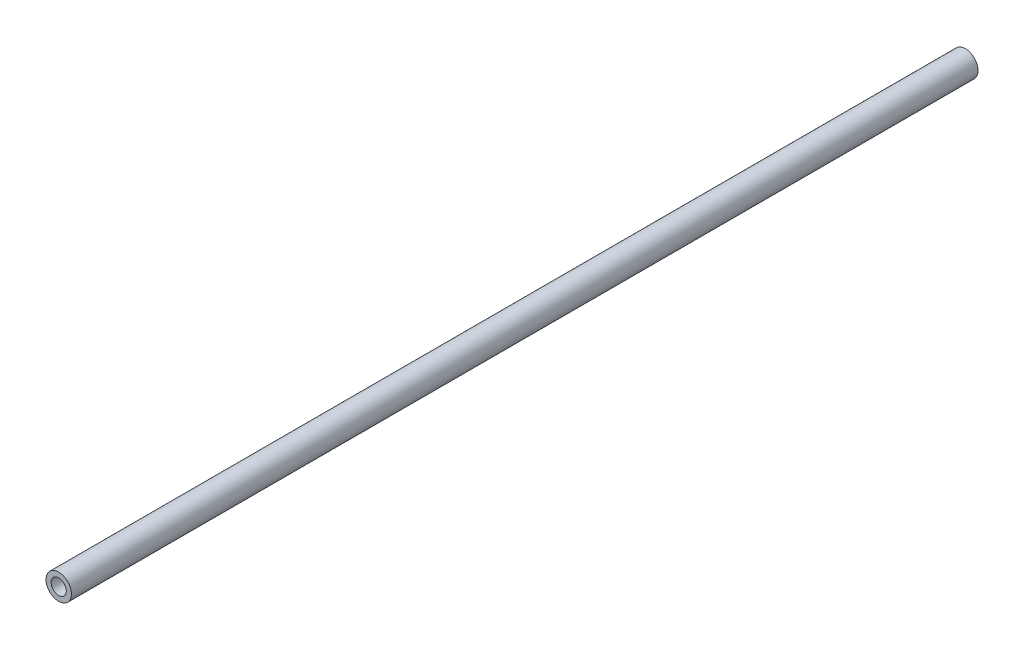
ISO-10303-21;
HEADER;
FILE_DESCRIPTION(('STEP AP214'),'2;1');
FILE_NAME('part.step','',(''),(''),'','','');
FILE_SCHEMA(('AUTOMOTIVE_DESIGN { 1 0 10303 214 1 1 1 1 }'));
ENDSEC;
DATA;
#1=APPLICATION_CONTEXT('core data for automotive mechanical design processes');
#2=APPLICATION_PROTOCOL_DEFINITION('international standard','automotive_design',2000,#1);
#3=PRODUCT_CONTEXT('',#1,'mechanical');
#4=PRODUCT('Part','Part','',(#3));
#5=PRODUCT_RELATED_PRODUCT_CATEGORY('part','',(#4));
#6=PRODUCT_DEFINITION_FORMATION('','',#4);
#7=PRODUCT_DEFINITION_CONTEXT('part definition',#1,'design');
#8=PRODUCT_DEFINITION('design','',#6,#7);
#9=PRODUCT_DEFINITION_SHAPE('','',#8);
#10=(LENGTH_UNIT() NAMED_UNIT(*) SI_UNIT(.MILLI.,.METRE.));
#11=(NAMED_UNIT(*) PLANE_ANGLE_UNIT() SI_UNIT($,.RADIAN.));
#12=(NAMED_UNIT(*) SI_UNIT($,.STERADIAN.) SOLID_ANGLE_UNIT());
#13=UNCERTAINTY_MEASURE_WITH_UNIT(LENGTH_MEASURE(1.E-05),#10,'distance_accuracy_value','');
#14=(GEOMETRIC_REPRESENTATION_CONTEXT(3) GLOBAL_UNCERTAINTY_ASSIGNED_CONTEXT((#13)) GLOBAL_UNIT_ASSIGNED_CONTEXT((#10,
#11,#12)) REPRESENTATION_CONTEXT('',''));
#15=CARTESIAN_POINT('',(0.,0.,0.));
#16=DIRECTION('',(0.,0.,1.));
#17=DIRECTION('',(1.,0.,0.));
#18=AXIS2_PLACEMENT_3D('',#15,#16,#17);
#19=CARTESIAN_POINT('',(0.,0.,304.8));
#20=DIRECTION('',(0.,0.,1.));
#21=DIRECTION('',(1.,0.,0.));
#22=AXIS2_PLACEMENT_3D('',#19,#20,#21);
#23=PLANE('',#22);
#24=CARTESIAN_POINT('',(0.,0.,304.8));
#25=DIRECTION('',(0.,0.,1.));
#26=DIRECTION('',(1.,0.,0.));
#27=AXIS2_PLACEMENT_3D('',#24,#25,#26);
#28=CIRCLE('',#27,8.5328125);
#29=CARTESIAN_POINT('',(-8.5328125,0.,304.8));
#30=VERTEX_POINT('',#29);
#31=EDGE_CURVE('E10',#30,#30,#28,.T.);
#32=ORIENTED_EDGE('',*,*,#31,.T.);
#33=EDGE_LOOP('',(#32));
#34=FACE_BOUND('',#33,.T.);
#35=CARTESIAN_POINT('',(0.,0.,304.8));
#36=DIRECTION('',(0.,0.,1.));
#37=DIRECTION('',(1.,0.,0.));
#38=AXIS2_PLACEMENT_3D('',#35,#36,#37);
#39=CIRCLE('',#38,5.1181);
#40=CARTESIAN_POINT('',(-5.1181,0.,304.8));
#41=VERTEX_POINT('',#40);
#42=EDGE_CURVE('E42',#41,#41,#39,.T.);
#43=ORIENTED_EDGE('',*,*,#42,.F.);
#44=EDGE_LOOP('',(#43));
#45=FACE_BOUND('',#44,.T.);
#46=ADVANCED_FACE('F35',(#34,#45),#23,.T.);
#47=CARTESIAN_POINT('',(0.,0.,304.8));
#48=DIRECTION('',(0.,0.,-1.));
#49=DIRECTION('',(-1.,0.,0.));
#50=AXIS2_PLACEMENT_3D('',#47,#48,#49);
#51=CYLINDRICAL_SURFACE('',#50,8.5328125);
#52=CARTESIAN_POINT('',(0.,0.,-304.8));
#53=DIRECTION('',(0.,0.,1.));
#54=DIRECTION('',(1.,0.,0.));
#55=AXIS2_PLACEMENT_3D('',#52,#53,#54);
#56=CIRCLE('',#55,8.5328125);
#57=CARTESIAN_POINT('',(-8.5328125,0.,-304.8));
#58=VERTEX_POINT('',#57);
#59=EDGE_CURVE('E46',#58,#58,#56,.T.);
#60=CARTESIAN_POINT('',(-8.5328125,0.,304.8));
#61=CARTESIAN_POINT('',(-8.5328125,0.,298.45));
#62=CARTESIAN_POINT('',(-8.5328125,0.,292.1));
#63=CARTESIAN_POINT('',(-8.5328125,0.,279.4));
#64=CARTESIAN_POINT('',(-8.5328125,0.,273.05));
#65=CARTESIAN_POINT('',(-8.5328125,0.,260.35));
#66=CARTESIAN_POINT('',(-8.5328125,0.,254.));
#67=CARTESIAN_POINT('',(-8.5328125,0.,241.3));
#68=CARTESIAN_POINT('',(-8.5328125,0.,234.95));
#69=CARTESIAN_POINT('',(-8.5328125,0.,222.25));
#70=CARTESIAN_POINT('',(-8.5328125,0.,215.9));
#71=CARTESIAN_POINT('',(-8.5328125,0.,203.2));
#72=CARTESIAN_POINT('',(-8.5328125,0.,196.85));
#73=CARTESIAN_POINT('',(-8.5328125,0.,184.15));
#74=CARTESIAN_POINT('',(-8.5328125,0.,177.8));
#75=CARTESIAN_POINT('',(-8.5328125,0.,165.1));
#76=CARTESIAN_POINT('',(-8.5328125,0.,158.75));
#77=CARTESIAN_POINT('',(-8.5328125,0.,146.05));
#78=CARTESIAN_POINT('',(-8.5328125,0.,139.7));
#79=CARTESIAN_POINT('',(-8.5328125,0.,127.));
#80=CARTESIAN_POINT('',(-8.5328125,0.,120.65));
#81=CARTESIAN_POINT('',(-8.5328125,0.,107.95));
#82=CARTESIAN_POINT('',(-8.5328125,0.,101.6));
#83=CARTESIAN_POINT('',(-8.5328125,0.,88.9));
#84=CARTESIAN_POINT('',(-8.5328125,0.,82.55));
#85=CARTESIAN_POINT('',(-8.5328125,0.,69.85));
#86=CARTESIAN_POINT('',(-8.5328125,0.,63.5));
#87=CARTESIAN_POINT('',(-8.5328125,0.,50.8));
#88=CARTESIAN_POINT('',(-8.5328125,0.,44.45));
#89=CARTESIAN_POINT('',(-8.5328125,0.,31.75));
#90=CARTESIAN_POINT('',(-8.5328125,0.,25.4));
#91=CARTESIAN_POINT('',(-8.5328125,0.,12.7));
#92=CARTESIAN_POINT('',(-8.5328125,0.,6.34999999999995));
#93=CARTESIAN_POINT('',(-8.5328125,0.,-6.35000000000006));
#94=CARTESIAN_POINT('',(-8.5328125,0.,-12.7000000000001));
#95=CARTESIAN_POINT('',(-8.5328125,0.,-25.4000000000001));
#96=CARTESIAN_POINT('',(-8.5328125,0.,-31.7500000000001));
#97=CARTESIAN_POINT('',(-8.5328125,0.,-44.4500000000001));
#98=CARTESIAN_POINT('',(-8.5328125,0.,-50.8000000000001));
#99=CARTESIAN_POINT('',(-8.5328125,0.,-63.5000000000001));
#100=CARTESIAN_POINT('',(-8.5328125,0.,-69.8500000000001));
#101=CARTESIAN_POINT('',(-8.5328125,0.,-82.5500000000001));
#102=CARTESIAN_POINT('',(-8.5328125,0.,-88.9000000000001));
#103=CARTESIAN_POINT('',(-8.5328125,0.,-101.6));
#104=CARTESIAN_POINT('',(-8.5328125,0.,-107.95));
#105=CARTESIAN_POINT('',(-8.5328125,0.,-120.65));
#106=CARTESIAN_POINT('',(-8.5328125,0.,-127.));
#107=CARTESIAN_POINT('',(-8.5328125,0.,-139.7));
#108=CARTESIAN_POINT('',(-8.5328125,0.,-146.05));
#109=CARTESIAN_POINT('',(-8.5328125,0.,-158.75));
#110=CARTESIAN_POINT('',(-8.5328125,0.,-165.1));
#111=CARTESIAN_POINT('',(-8.5328125,0.,-177.8));
#112=CARTESIAN_POINT('',(-8.5328125,0.,-184.15));
#113=CARTESIAN_POINT('',(-8.5328125,0.,-196.85));
#114=CARTESIAN_POINT('',(-8.5328125,0.,-203.2));
#115=CARTESIAN_POINT('',(-8.5328125,0.,-215.9));
#116=CARTESIAN_POINT('',(-8.5328125,0.,-222.25));
#117=CARTESIAN_POINT('',(-8.5328125,0.,-234.95));
#118=CARTESIAN_POINT('',(-8.5328125,0.,-241.3));
#119=CARTESIAN_POINT('',(-8.5328125,0.,-254.));
#120=CARTESIAN_POINT('',(-8.5328125,0.,-260.35));
#121=CARTESIAN_POINT('',(-8.5328125,0.,-273.05));
#122=CARTESIAN_POINT('',(-8.5328125,0.,-279.4));
#123=CARTESIAN_POINT('',(-8.5328125,0.,-292.1));
#124=CARTESIAN_POINT('',(-8.5328125,0.,-298.45));
#125=CARTESIAN_POINT('',(-8.5328125,0.,-304.8));
#126=B_SPLINE_CURVE_WITH_KNOTS('',3,(#60,#61,#62,#63,#64,#65,#66,#67,#68,#69,#70,#71,#72,#73,
#74,#75,#76,#77,#78,#79,#80,#81,#82,#83,#84,#85,#86,#87,#88,#89,#90,#91,#92,#93,#94,#95,#96,#97,
#98,#99,#100,#101,#102,#103,#104,#105,#106,#107,#108,#109,#110,#111,#112,#113,#114,#115,#116,
#117,#118,#119,#120,#121,#122,#123,#124,#125),.UNSPECIFIED.,.F.,.F.,(4,2,2,2,2,2,2,2,2,2,2,2,2,
2,2,2,2,2,2,2,2,2,2,2,2,2,2,2,2,2,2,2,4),(0.,19.05,38.1,57.15,76.2,95.25,114.3,133.35,152.4,
171.45,190.5,209.55,228.6,247.65,266.7,285.75,304.8,323.85,342.9,361.95,381.,400.05,419.1,
438.15,457.2,476.25,495.3,514.35,533.4,552.45,571.5,590.55,609.6),.UNSPECIFIED.);
#127=EDGE_CURVE('BSEAM37',#30,#58,#126,.T.);
#128=ORIENTED_EDGE('',*,*,#31,.F.);
#129=ORIENTED_EDGE('',*,*,#59,.T.);
#130=ORIENTED_EDGE('',*,*,#127,.T.);
#131=ORIENTED_EDGE('',*,*,#127,.F.);
#132=EDGE_LOOP('',(#128,#130,#129,#131));
#133=FACE_BOUND('',#132,.T.);
#134=ADVANCED_FACE('F37',(#133),#51,.T.);
#135=CARTESIAN_POINT('',(0.,0.,304.8));
#136=DIRECTION('',(0.,0.,-1.));
#137=DIRECTION('',(-1.,0.,0.));
#138=AXIS2_PLACEMENT_3D('',#135,#136,#137);
#139=CYLINDRICAL_SURFACE('',#138,5.1181);
#140=CARTESIAN_POINT('',(0.,0.,-304.8));
#141=DIRECTION('',(0.,0.,1.));
#142=DIRECTION('',(1.,0.,0.));
#143=AXIS2_PLACEMENT_3D('',#140,#141,#142);
#144=CIRCLE('',#143,5.1181);
#145=CARTESIAN_POINT('',(-5.1181,0.,-304.8));
#146=VERTEX_POINT('',#145);
#147=EDGE_CURVE('E50',#146,#146,#144,.T.);
#148=CARTESIAN_POINT('',(-5.1181,0.,304.8));
#149=CARTESIAN_POINT('',(-5.1181,0.,298.45));
#150=CARTESIAN_POINT('',(-5.1181,0.,292.1));
#151=CARTESIAN_POINT('',(-5.1181,0.,279.4));
#152=CARTESIAN_POINT('',(-5.1181,0.,273.05));
#153=CARTESIAN_POINT('',(-5.1181,0.,260.35));
#154=CARTESIAN_POINT('',(-5.1181,0.,254.));
#155=CARTESIAN_POINT('',(-5.1181,0.,241.3));
#156=CARTESIAN_POINT('',(-5.1181,0.,234.95));
#157=CARTESIAN_POINT('',(-5.1181,0.,222.25));
#158=CARTESIAN_POINT('',(-5.1181,0.,215.9));
#159=CARTESIAN_POINT('',(-5.1181,0.,203.2));
#160=CARTESIAN_POINT('',(-5.1181,0.,196.85));
#161=CARTESIAN_POINT('',(-5.1181,0.,184.15));
#162=CARTESIAN_POINT('',(-5.1181,0.,177.8));
#163=CARTESIAN_POINT('',(-5.1181,0.,165.1));
#164=CARTESIAN_POINT('',(-5.1181,0.,158.75));
#165=CARTESIAN_POINT('',(-5.1181,0.,146.05));
#166=CARTESIAN_POINT('',(-5.1181,0.,139.7));
#167=CARTESIAN_POINT('',(-5.1181,0.,127.));
#168=CARTESIAN_POINT('',(-5.1181,0.,120.65));
#169=CARTESIAN_POINT('',(-5.1181,0.,107.95));
#170=CARTESIAN_POINT('',(-5.1181,0.,101.6));
#171=CARTESIAN_POINT('',(-5.1181,0.,88.9));
#172=CARTESIAN_POINT('',(-5.1181,0.,82.55));
#173=CARTESIAN_POINT('',(-5.1181,0.,69.85));
#174=CARTESIAN_POINT('',(-5.1181,0.,63.5));
#175=CARTESIAN_POINT('',(-5.1181,0.,50.8));
#176=CARTESIAN_POINT('',(-5.1181,0.,44.45));
#177=CARTESIAN_POINT('',(-5.1181,0.,31.75));
#178=CARTESIAN_POINT('',(-5.1181,0.,25.4));
#179=CARTESIAN_POINT('',(-5.1181,0.,12.7));
#180=CARTESIAN_POINT('',(-5.1181,0.,6.34999999999995));
#181=CARTESIAN_POINT('',(-5.1181,0.,-6.35000000000006));
#182=CARTESIAN_POINT('',(-5.1181,0.,-12.7000000000001));
#183=CARTESIAN_POINT('',(-5.1181,0.,-25.4000000000001));
#184=CARTESIAN_POINT('',(-5.1181,0.,-31.7500000000001));
#185=CARTESIAN_POINT('',(-5.1181,0.,-44.4500000000001));
#186=CARTESIAN_POINT('',(-5.1181,0.,-50.8000000000001));
#187=CARTESIAN_POINT('',(-5.1181,0.,-63.5000000000001));
#188=CARTESIAN_POINT('',(-5.1181,0.,-69.8500000000001));
#189=CARTESIAN_POINT('',(-5.1181,0.,-82.5500000000001));
#190=CARTESIAN_POINT('',(-5.1181,0.,-88.9000000000001));
#191=CARTESIAN_POINT('',(-5.1181,0.,-101.6));
#192=CARTESIAN_POINT('',(-5.1181,0.,-107.95));
#193=CARTESIAN_POINT('',(-5.1181,0.,-120.65));
#194=CARTESIAN_POINT('',(-5.1181,0.,-127.));
#195=CARTESIAN_POINT('',(-5.1181,0.,-139.7));
#196=CARTESIAN_POINT('',(-5.1181,0.,-146.05));
#197=CARTESIAN_POINT('',(-5.1181,0.,-158.75));
#198=CARTESIAN_POINT('',(-5.1181,0.,-165.1));
#199=CARTESIAN_POINT('',(-5.1181,0.,-177.8));
#200=CARTESIAN_POINT('',(-5.1181,0.,-184.15));
#201=CARTESIAN_POINT('',(-5.1181,0.,-196.85));
#202=CARTESIAN_POINT('',(-5.1181,0.,-203.2));
#203=CARTESIAN_POINT('',(-5.1181,0.,-215.9));
#204=CARTESIAN_POINT('',(-5.1181,0.,-222.25));
#205=CARTESIAN_POINT('',(-5.1181,0.,-234.95));
#206=CARTESIAN_POINT('',(-5.1181,0.,-241.3));
#207=CARTESIAN_POINT('',(-5.1181,0.,-254.));
#208=CARTESIAN_POINT('',(-5.1181,0.,-260.35));
#209=CARTESIAN_POINT('',(-5.1181,0.,-273.05));
#210=CARTESIAN_POINT('',(-5.1181,0.,-279.4));
#211=CARTESIAN_POINT('',(-5.1181,0.,-292.1));
#212=CARTESIAN_POINT('',(-5.1181,0.,-298.45));
#213=CARTESIAN_POINT('',(-5.1181,0.,-304.8));
#214=B_SPLINE_CURVE_WITH_KNOTS('',3,(#148,#149,#150,#151,#152,#153,#154,#155,#156,#157,#158,
#159,#160,#161,#162,#163,#164,#165,#166,#167,#168,#169,#170,#171,#172,#173,#174,#175,#176,#177,
#178,#179,#180,#181,#182,#183,#184,#185,#186,#187,#188,#189,#190,#191,#192,#193,#194,#195,#196,
#197,#198,#199,#200,#201,#202,#203,#204,#205,#206,#207,#208,#209,#210,#211,#212,#213),
.UNSPECIFIED.,.F.,.F.,(4,2,2,2,2,2,2,2,2,2,2,2,2,2,2,2,2,2,2,2,2,2,2,2,2,2,2,2,2,2,2,2,4),(0.,
19.05,38.1,57.15,76.2,95.25,114.3,133.35,152.4,171.45,190.5,209.55,228.6,247.65,266.7,285.75,
304.8,323.85,342.9,361.95,381.,400.05,419.1,438.15,457.2,476.25,495.3,514.35,533.4,552.45,571.5,
590.55,609.6),.UNSPECIFIED.);
#215=EDGE_CURVE('BSEAM59',#41,#146,#214,.T.);
#216=ORIENTED_EDGE('',*,*,#42,.T.);
#217=ORIENTED_EDGE('',*,*,#147,.F.);
#218=ORIENTED_EDGE('',*,*,#215,.T.);
#219=ORIENTED_EDGE('',*,*,#215,.F.);
#220=EDGE_LOOP('',(#216,#218,#217,#219));
#221=FACE_BOUND('',#220,.T.);
#222=ADVANCED_FACE('F59',(#221),#139,.F.);
#223=CARTESIAN_POINT('',(0.,0.,-304.8));
#224=DIRECTION('',(0.,0.,1.));
#225=DIRECTION('',(1.,0.,0.));
#226=AXIS2_PLACEMENT_3D('',#223,#224,#225);
#227=PLANE('',#226);
#228=ORIENTED_EDGE('',*,*,#147,.T.);
#229=EDGE_LOOP('',(#228));
#230=FACE_BOUND('',#229,.T.);
#231=ORIENTED_EDGE('',*,*,#59,.F.);
#232=EDGE_LOOP('',(#231));
#233=FACE_BOUND('',#232,.T.);
#234=ADVANCED_FACE('F56',(#230,#233),#227,.F.);
#235=CLOSED_SHELL('',(#46,#134,#222,#234));
#236=MANIFOLD_SOLID_BREP('B2',#235);
#237=ADVANCED_BREP_SHAPE_REPRESENTATION('',(#18,#236),#14);
#238=SHAPE_DEFINITION_REPRESENTATION(#9,#237);
ENDSEC;
END-ISO-10303-21;
